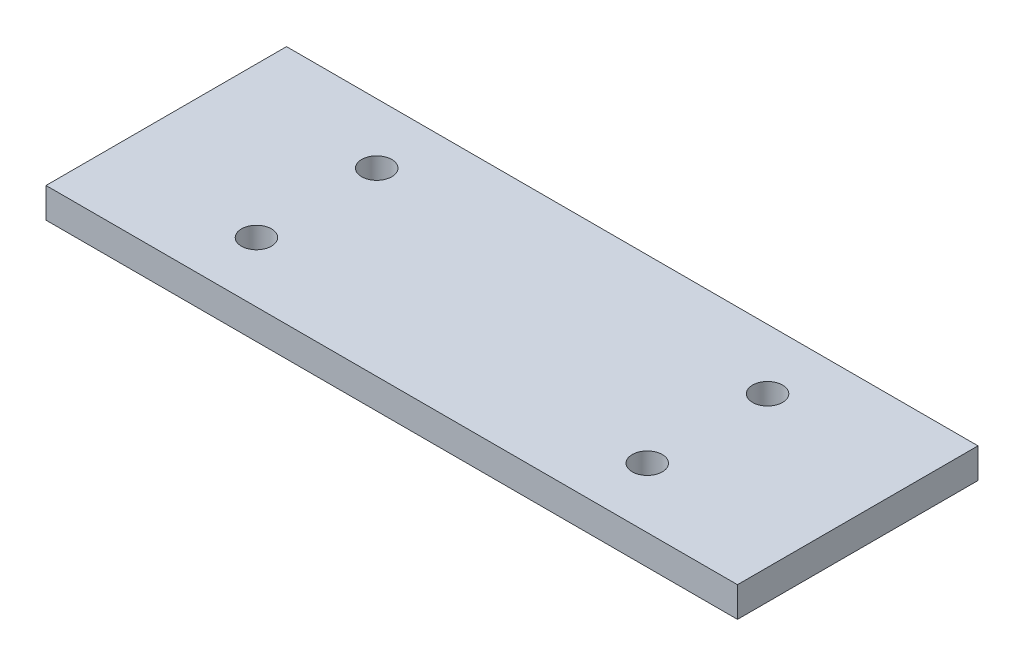
ISO-10303-21;
HEADER;
FILE_DESCRIPTION(('STEP AP214'),'2;1');
FILE_NAME('part.step','',(''),(''),'','','');
FILE_SCHEMA(('AUTOMOTIVE_DESIGN { 1 0 10303 214 1 1 1 1 }'));
ENDSEC;
DATA;
#1=APPLICATION_CONTEXT('core data for automotive mechanical design processes');
#2=APPLICATION_PROTOCOL_DEFINITION('international standard','automotive_design',2000,#1);
#3=PRODUCT_CONTEXT('',#1,'mechanical');
#4=PRODUCT('Part','Part','',(#3));
#5=PRODUCT_RELATED_PRODUCT_CATEGORY('part','',(#4));
#6=PRODUCT_DEFINITION_FORMATION('','',#4);
#7=PRODUCT_DEFINITION_CONTEXT('part definition',#1,'design');
#8=PRODUCT_DEFINITION('design','',#6,#7);
#9=PRODUCT_DEFINITION_SHAPE('','',#8);
#10=(LENGTH_UNIT() NAMED_UNIT(*) SI_UNIT(.MILLI.,.METRE.));
#11=(NAMED_UNIT(*) PLANE_ANGLE_UNIT() SI_UNIT($,.RADIAN.));
#12=(NAMED_UNIT(*) SI_UNIT($,.STERADIAN.) SOLID_ANGLE_UNIT());
#13=UNCERTAINTY_MEASURE_WITH_UNIT(LENGTH_MEASURE(1.E-05),#10,'distance_accuracy_value','');
#14=(GEOMETRIC_REPRESENTATION_CONTEXT(3) GLOBAL_UNCERTAINTY_ASSIGNED_CONTEXT((#13)) GLOBAL_UNIT_ASSIGNED_CONTEXT((#10,
#11,#12)) REPRESENTATION_CONTEXT('',''));
#15=CARTESIAN_POINT('',(0.,0.,0.));
#16=DIRECTION('',(0.,0.,1.));
#17=DIRECTION('',(1.,0.,0.));
#18=AXIS2_PLACEMENT_3D('',#15,#16,#17);
#19=CARTESIAN_POINT('',(0.,5.,0.));
#20=DIRECTION('',(0.,1.,0.));
#21=DIRECTION('',(0.,0.,1.));
#22=AXIS2_PLACEMENT_3D('',#19,#20,#21);
#23=PLANE('',#22);
#24=CARTESIAN_POINT('',(32.5,5.,10.));
#25=DIRECTION('',(0.,1.,0.));
#26=DIRECTION('',(0.,0.,1.));
#27=AXIS2_PLACEMENT_3D('',#24,#25,#26);
#28=CIRCLE('',#27,2.5);
#29=CARTESIAN_POINT('',(32.5,5.,12.5));
#30=VERTEX_POINT('',#29);
#31=EDGE_CURVE('E129',#30,#30,#28,.T.);
#32=ORIENTED_EDGE('',*,*,#31,.F.);
#33=EDGE_LOOP('',(#32));
#34=FACE_BOUND('',#33,.T.);
#35=CARTESIAN_POINT('',(-32.5,5.,-10.));
#36=DIRECTION('',(0.,1.,0.));
#37=DIRECTION('',(0.,0.,1.));
#38=AXIS2_PLACEMENT_3D('',#35,#36,#37);
#39=CIRCLE('',#38,2.5);
#40=CARTESIAN_POINT('',(-32.5,5.,-7.5));
#41=VERTEX_POINT('',#40);
#42=EDGE_CURVE('E108',#41,#41,#39,.T.);
#43=ORIENTED_EDGE('',*,*,#42,.F.);
#44=EDGE_LOOP('',(#43));
#45=FACE_BOUND('',#44,.T.);
#46=DIRECTION('',(0.,0.,-1.));
#47=VECTOR('',#46,1.);
#48=CARTESIAN_POINT('',(57.5,5.,-20.));
#49=LINE('',#48,#47);
#50=CARTESIAN_POINT('',(57.5,5.,20.));
#51=VERTEX_POINT('',#50);
#52=CARTESIAN_POINT('',(57.5,5.,-20.));
#53=VERTEX_POINT('',#52);
#54=EDGE_CURVE('E93',#51,#53,#49,.T.);
#55=ORIENTED_EDGE('',*,*,#54,.T.);
#56=DIRECTION('',(-1.,0.,0.));
#57=VECTOR('',#56,1.);
#58=CARTESIAN_POINT('',(-57.5,5.,-20.));
#59=LINE('',#58,#57);
#60=CARTESIAN_POINT('',(-57.5,5.,-20.));
#61=VERTEX_POINT('',#60);
#62=EDGE_CURVE('E88',#53,#61,#59,.T.);
#63=ORIENTED_EDGE('',*,*,#62,.T.);
#64=DIRECTION('',(0.,0.,1.));
#65=VECTOR('',#64,1.);
#66=CARTESIAN_POINT('',(-57.5,5.,-20.));
#67=LINE('',#66,#65);
#68=CARTESIAN_POINT('',(-57.5,5.,20.));
#69=VERTEX_POINT('',#68);
#70=EDGE_CURVE('E91',#61,#69,#67,.T.);
#71=ORIENTED_EDGE('',*,*,#70,.T.);
#72=DIRECTION('',(1.,0.,0.));
#73=VECTOR('',#72,1.);
#74=CARTESIAN_POINT('',(-57.5,5.,20.));
#75=LINE('',#74,#73);
#76=EDGE_CURVE('E58',#69,#51,#75,.T.);
#77=ORIENTED_EDGE('',*,*,#76,.T.);
#78=EDGE_LOOP('',(#55,#63,#71,#77));
#79=FACE_BOUND('',#78,.T.);
#80=CARTESIAN_POINT('',(-32.5,5.,10.));
#81=DIRECTION('',(0.,1.,0.));
#82=DIRECTION('',(0.,0.,-1.));
#83=AXIS2_PLACEMENT_3D('',#80,#81,#82);
#84=CIRCLE('',#83,2.5);
#85=CARTESIAN_POINT('',(-32.5,5.,7.5));
#86=VERTEX_POINT('',#85);
#87=EDGE_CURVE('E123',#86,#86,#84,.T.);
#88=ORIENTED_EDGE('',*,*,#87,.F.);
#89=EDGE_LOOP('',(#88));
#90=FACE_BOUND('',#89,.T.);
#91=CARTESIAN_POINT('',(32.5,5.,-10.));
#92=DIRECTION('',(0.,1.,0.));
#93=DIRECTION('',(0.,0.,-1.));
#94=AXIS2_PLACEMENT_3D('',#91,#92,#93);
#95=CIRCLE('',#94,2.5);
#96=CARTESIAN_POINT('',(32.5,5.,-12.5));
#97=VERTEX_POINT('',#96);
#98=EDGE_CURVE('E135',#97,#97,#95,.T.);
#99=ORIENTED_EDGE('',*,*,#98,.F.);
#100=EDGE_LOOP('',(#99));
#101=FACE_BOUND('',#100,.T.);
#102=ADVANCED_FACE('F41',(#34,#45,#79,#90,#101),#23,.T.);
#103=CARTESIAN_POINT('',(0.,0.,0.));
#104=DIRECTION('',(0.,1.,0.));
#105=DIRECTION('',(0.,0.,1.));
#106=AXIS2_PLACEMENT_3D('',#103,#104,#105);
#107=PLANE('',#106);
#108=DIRECTION('',(0.,0.,-1.));
#109=VECTOR('',#108,1.);
#110=CARTESIAN_POINT('',(57.5,0.,-20.));
#111=LINE('',#110,#109);
#112=CARTESIAN_POINT('',(57.5,0.,20.));
#113=VERTEX_POINT('',#112);
#114=CARTESIAN_POINT('',(57.5,0.,-20.));
#115=VERTEX_POINT('',#114);
#116=EDGE_CURVE('E105',#113,#115,#111,.T.);
#117=ORIENTED_EDGE('',*,*,#116,.F.);
#118=DIRECTION('',(1.,0.,0.));
#119=VECTOR('',#118,1.);
#120=CARTESIAN_POINT('',(-57.5,0.,20.));
#121=LINE('',#120,#119);
#122=CARTESIAN_POINT('',(-57.5,0.,20.));
#123=VERTEX_POINT('',#122);
#124=EDGE_CURVE('E81',#123,#113,#121,.T.);
#125=ORIENTED_EDGE('',*,*,#124,.F.);
#126=DIRECTION('',(0.,0.,1.));
#127=VECTOR('',#126,1.);
#128=CARTESIAN_POINT('',(-57.5,0.,-20.));
#129=LINE('',#128,#127);
#130=CARTESIAN_POINT('',(-57.5,0.,-20.));
#131=VERTEX_POINT('',#130);
#132=EDGE_CURVE('E75',#131,#123,#129,.T.);
#133=ORIENTED_EDGE('',*,*,#132,.F.);
#134=DIRECTION('',(-1.,0.,0.));
#135=VECTOR('',#134,1.);
#136=CARTESIAN_POINT('',(-57.5,0.,-20.));
#137=LINE('',#136,#135);
#138=EDGE_CURVE('E97',#115,#131,#137,.T.);
#139=ORIENTED_EDGE('',*,*,#138,.F.);
#140=EDGE_LOOP('',(#117,#125,#133,#139));
#141=FACE_BOUND('',#140,.T.);
#142=CARTESIAN_POINT('',(-32.5,0.,-10.));
#143=DIRECTION('',(0.,1.,0.));
#144=DIRECTION('',(0.,0.,1.));
#145=AXIS2_PLACEMENT_3D('',#142,#143,#144);
#146=CIRCLE('',#145,2.5);
#147=CARTESIAN_POINT('',(-32.5,0.,-7.5));
#148=VERTEX_POINT('',#147);
#149=EDGE_CURVE('E120',#148,#148,#146,.T.);
#150=ORIENTED_EDGE('',*,*,#149,.T.);
#151=EDGE_LOOP('',(#150));
#152=FACE_BOUND('',#151,.T.);
#153=CARTESIAN_POINT('',(-32.5,0.,10.));
#154=DIRECTION('',(0.,1.,0.));
#155=DIRECTION('',(0.,0.,-1.));
#156=AXIS2_PLACEMENT_3D('',#153,#154,#155);
#157=CIRCLE('',#156,2.5);
#158=CARTESIAN_POINT('',(-32.5,0.,7.5));
#159=VERTEX_POINT('',#158);
#160=EDGE_CURVE('E126',#159,#159,#157,.T.);
#161=ORIENTED_EDGE('',*,*,#160,.T.);
#162=EDGE_LOOP('',(#161));
#163=FACE_BOUND('',#162,.T.);
#164=CARTESIAN_POINT('',(32.5,0.,10.));
#165=DIRECTION('',(0.,1.,0.));
#166=DIRECTION('',(0.,0.,1.));
#167=AXIS2_PLACEMENT_3D('',#164,#165,#166);
#168=CIRCLE('',#167,2.5);
#169=CARTESIAN_POINT('',(32.5,0.,12.5));
#170=VERTEX_POINT('',#169);
#171=EDGE_CURVE('E132',#170,#170,#168,.T.);
#172=ORIENTED_EDGE('',*,*,#171,.T.);
#173=EDGE_LOOP('',(#172));
#174=FACE_BOUND('',#173,.T.);
#175=CARTESIAN_POINT('',(32.5,0.,-10.));
#176=DIRECTION('',(0.,1.,0.));
#177=DIRECTION('',(0.,0.,-1.));
#178=AXIS2_PLACEMENT_3D('',#175,#176,#177);
#179=CIRCLE('',#178,2.5);
#180=CARTESIAN_POINT('',(32.5,0.,-12.5));
#181=VERTEX_POINT('',#180);
#182=EDGE_CURVE('E138',#181,#181,#179,.T.);
#183=ORIENTED_EDGE('',*,*,#182,.T.);
#184=EDGE_LOOP('',(#183));
#185=FACE_BOUND('',#184,.T.);
#186=ADVANCED_FACE('F116',(#141,#152,#163,#174,#185),#107,.F.);
#187=CARTESIAN_POINT('',(57.5,5.,-20.));
#188=DIRECTION('',(-1.,0.,0.));
#189=DIRECTION('',(0.,0.,1.));
#190=AXIS2_PLACEMENT_3D('',#187,#188,#189);
#191=PLANE('',#190);
#192=ORIENTED_EDGE('',*,*,#116,.T.);
#193=DIRECTION('',(0.,-1.,0.));
#194=VECTOR('',#193,1.);
#195=CARTESIAN_POINT('',(57.5,5.,-20.));
#196=LINE('',#195,#194);
#197=EDGE_CURVE('E11',#53,#115,#196,.T.);
#198=ORIENTED_EDGE('',*,*,#197,.F.);
#199=ORIENTED_EDGE('',*,*,#54,.F.);
#200=DIRECTION('',(0.,-1.,0.));
#201=VECTOR('',#200,1.);
#202=CARTESIAN_POINT('',(57.5,5.,20.));
#203=LINE('',#202,#201);
#204=EDGE_CURVE('E101',#51,#113,#203,.T.);
#205=ORIENTED_EDGE('',*,*,#204,.T.);
#206=EDGE_LOOP('',(#192,#198,#199,#205));
#207=FACE_BOUND('',#206,.T.);
#208=ADVANCED_FACE('F43',(#207),#191,.F.);
#209=CARTESIAN_POINT('',(-57.5,5.,-20.));
#210=DIRECTION('',(0.,0.,1.));
#211=DIRECTION('',(1.,0.,0.));
#212=AXIS2_PLACEMENT_3D('',#209,#210,#211);
#213=PLANE('',#212);
#214=ORIENTED_EDGE('',*,*,#138,.T.);
#215=DIRECTION('',(0.,-1.,0.));
#216=VECTOR('',#215,1.);
#217=CARTESIAN_POINT('',(-57.5,5.,-20.));
#218=LINE('',#217,#216);
#219=EDGE_CURVE('E50',#61,#131,#218,.T.);
#220=ORIENTED_EDGE('',*,*,#219,.F.);
#221=ORIENTED_EDGE('',*,*,#62,.F.);
#222=ORIENTED_EDGE('',*,*,#197,.T.);
#223=EDGE_LOOP('',(#214,#220,#221,#222));
#224=FACE_BOUND('',#223,.T.);
#225=ADVANCED_FACE('F96',(#224),#213,.F.);
#226=CARTESIAN_POINT('',(-57.5,5.,-20.));
#227=DIRECTION('',(1.,0.,0.));
#228=DIRECTION('',(0.,0.,-1.));
#229=AXIS2_PLACEMENT_3D('',#226,#227,#228);
#230=PLANE('',#229);
#231=ORIENTED_EDGE('',*,*,#132,.T.);
#232=DIRECTION('',(0.,-1.,0.));
#233=VECTOR('',#232,1.);
#234=CARTESIAN_POINT('',(-57.5,5.,20.));
#235=LINE('',#234,#233);
#236=EDGE_CURVE('E98',#69,#123,#235,.T.);
#237=ORIENTED_EDGE('',*,*,#236,.F.);
#238=ORIENTED_EDGE('',*,*,#70,.F.);
#239=ORIENTED_EDGE('',*,*,#219,.T.);
#240=EDGE_LOOP('',(#231,#237,#238,#239));
#241=FACE_BOUND('',#240,.T.);
#242=ADVANCED_FACE('F99',(#241),#230,.F.);
#243=CARTESIAN_POINT('',(-57.5,5.,20.));
#244=DIRECTION('',(0.,0.,-1.));
#245=DIRECTION('',(-1.,0.,0.));
#246=AXIS2_PLACEMENT_3D('',#243,#244,#245);
#247=PLANE('',#246);
#248=ORIENTED_EDGE('',*,*,#124,.T.);
#249=ORIENTED_EDGE('',*,*,#204,.F.);
#250=ORIENTED_EDGE('',*,*,#76,.F.);
#251=ORIENTED_EDGE('',*,*,#236,.T.);
#252=EDGE_LOOP('',(#248,#249,#250,#251));
#253=FACE_BOUND('',#252,.T.);
#254=ADVANCED_FACE('F113',(#253),#247,.F.);
#255=CARTESIAN_POINT('',(-32.5,5.,-10.));
#256=DIRECTION('',(0.,-1.,0.));
#257=DIRECTION('',(0.,0.,-1.));
#258=AXIS2_PLACEMENT_3D('',#255,#256,#257);
#259=CYLINDRICAL_SURFACE('',#258,2.5);
#260=ORIENTED_EDGE('',*,*,#42,.T.);
#261=EDGE_LOOP('',(#260));
#262=FACE_BOUND('',#261,.T.);
#263=ORIENTED_EDGE('',*,*,#149,.F.);
#264=EDGE_LOOP('',(#263));
#265=FACE_BOUND('',#264,.T.);
#266=ADVANCED_FACE('F157',(#262,#265),#259,.F.);
#267=CARTESIAN_POINT('',(-32.5,5.,10.));
#268=DIRECTION('',(0.,-1.,0.));
#269=DIRECTION('',(0.,0.,-1.));
#270=AXIS2_PLACEMENT_3D('',#267,#268,#269);
#271=CYLINDRICAL_SURFACE('',#270,2.5);
#272=ORIENTED_EDGE('',*,*,#87,.T.);
#273=EDGE_LOOP('',(#272));
#274=FACE_BOUND('',#273,.T.);
#275=ORIENTED_EDGE('',*,*,#160,.F.);
#276=EDGE_LOOP('',(#275));
#277=FACE_BOUND('',#276,.T.);
#278=ADVANCED_FACE('F211',(#274,#277),#271,.F.);
#279=CARTESIAN_POINT('',(32.5,5.,10.));
#280=DIRECTION('',(0.,-1.,0.));
#281=DIRECTION('',(0.,0.,-1.));
#282=AXIS2_PLACEMENT_3D('',#279,#280,#281);
#283=CYLINDRICAL_SURFACE('',#282,2.5);
#284=ORIENTED_EDGE('',*,*,#31,.T.);
#285=EDGE_LOOP('',(#284));
#286=FACE_BOUND('',#285,.T.);
#287=ORIENTED_EDGE('',*,*,#171,.F.);
#288=EDGE_LOOP('',(#287));
#289=FACE_BOUND('',#288,.T.);
#290=ADVANCED_FACE('F220',(#286,#289),#283,.F.);
#291=CARTESIAN_POINT('',(32.5,5.,-10.));
#292=DIRECTION('',(0.,-1.,0.));
#293=DIRECTION('',(0.,0.,-1.));
#294=AXIS2_PLACEMENT_3D('',#291,#292,#293);
#295=CYLINDRICAL_SURFACE('',#294,2.5);
#296=ORIENTED_EDGE('',*,*,#98,.T.);
#297=EDGE_LOOP('',(#296));
#298=FACE_BOUND('',#297,.T.);
#299=ORIENTED_EDGE('',*,*,#182,.F.);
#300=EDGE_LOOP('',(#299));
#301=FACE_BOUND('',#300,.T.);
#302=ADVANCED_FACE('F144',(#298,#301),#295,.F.);
#303=CLOSED_SHELL('',(#102,#186,#208,#225,#242,#254,#266,#278,#290,#302));
#304=MANIFOLD_SOLID_BREP('B2',#303);
#305=ADVANCED_BREP_SHAPE_REPRESENTATION('',(#18,#304),#14);
#306=SHAPE_DEFINITION_REPRESENTATION(#9,#305);
ENDSEC;
END-ISO-10303-21;
